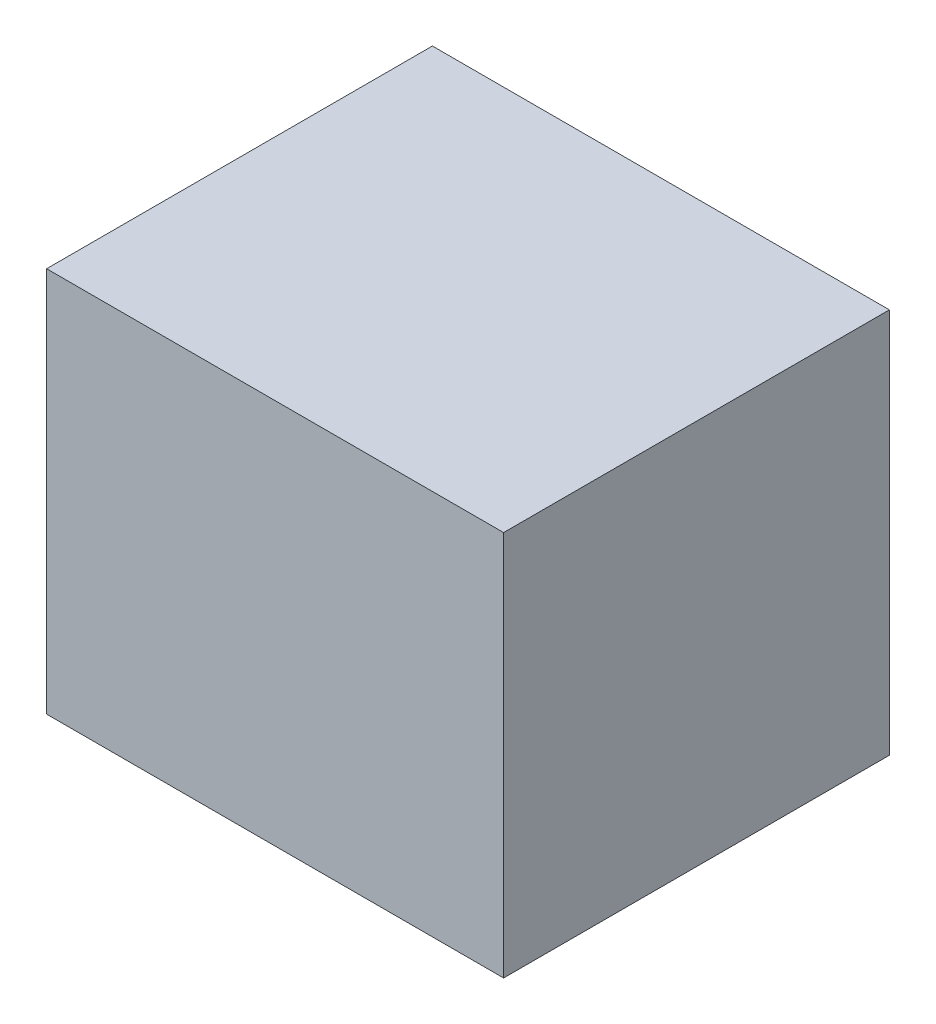
ISO-10303-21;
HEADER;
FILE_DESCRIPTION(('STEP AP214'),'2;1');
FILE_NAME('part.step','',(''),(''),'','','');
FILE_SCHEMA(('AUTOMOTIVE_DESIGN { 1 0 10303 214 1 1 1 1 }'));
ENDSEC;
DATA;
#1=APPLICATION_CONTEXT('core data for automotive mechanical design processes');
#2=APPLICATION_PROTOCOL_DEFINITION('international standard','automotive_design',2000,#1);
#3=PRODUCT_CONTEXT('',#1,'mechanical');
#4=PRODUCT('Part','Part','',(#3));
#5=PRODUCT_RELATED_PRODUCT_CATEGORY('part','',(#4));
#6=PRODUCT_DEFINITION_FORMATION('','',#4);
#7=PRODUCT_DEFINITION_CONTEXT('part definition',#1,'design');
#8=PRODUCT_DEFINITION('design','',#6,#7);
#9=PRODUCT_DEFINITION_SHAPE('','',#8);
#10=(LENGTH_UNIT() NAMED_UNIT(*) SI_UNIT(.MILLI.,.METRE.));
#11=(NAMED_UNIT(*) PLANE_ANGLE_UNIT() SI_UNIT($,.RADIAN.));
#12=(NAMED_UNIT(*) SI_UNIT($,.STERADIAN.) SOLID_ANGLE_UNIT());
#13=UNCERTAINTY_MEASURE_WITH_UNIT(LENGTH_MEASURE(1.E-05),#10,'distance_accuracy_value','');
#14=(GEOMETRIC_REPRESENTATION_CONTEXT(3) GLOBAL_UNCERTAINTY_ASSIGNED_CONTEXT((#13)) GLOBAL_UNIT_ASSIGNED_CONTEXT((#10,
#11,#12)) REPRESENTATION_CONTEXT('',''));
#15=CARTESIAN_POINT('',(0.,0.,0.));
#16=DIRECTION('',(0.,0.,1.));
#17=DIRECTION('',(1.,0.,0.));
#18=AXIS2_PLACEMENT_3D('',#15,#16,#17);
#19=CARTESIAN_POINT('',(-122.2375,-103.1875,-206.375));
#20=DIRECTION('',(1.,0.,0.));
#21=DIRECTION('',(0.,0.,-1.));
#22=AXIS2_PLACEMENT_3D('',#19,#20,#21);
#23=PLANE('',#22);
#24=DIRECTION('',(0.,1.,0.));
#25=VECTOR('',#24,1.);
#26=CARTESIAN_POINT('',(-122.2375,-103.1875,0.));
#27=LINE('',#26,#25);
#28=CARTESIAN_POINT('',(-122.2375,-103.1875,0.));
#29=VERTEX_POINT('',#28);
#30=CARTESIAN_POINT('',(-122.2375,103.1875,0.));
#31=VERTEX_POINT('',#30);
#32=EDGE_CURVE('E150',#29,#31,#27,.T.);
#33=ORIENTED_EDGE('',*,*,#32,.T.);
#34=DIRECTION('',(0.,0.,1.));
#35=VECTOR('',#34,1.);
#36=CARTESIAN_POINT('',(-122.2375,103.1875,-206.375));
#37=LINE('',#36,#35);
#38=CARTESIAN_POINT('',(-122.2375,103.1875,-206.375));
#39=VERTEX_POINT('',#38);
#40=EDGE_CURVE('E11',#39,#31,#37,.T.);
#41=ORIENTED_EDGE('',*,*,#40,.F.);
#42=DIRECTION('',(0.,1.,0.));
#43=VECTOR('',#42,1.);
#44=CARTESIAN_POINT('',(-122.2375,-103.1875,-206.375));
#45=LINE('',#44,#43);
#46=CARTESIAN_POINT('',(-122.2375,-103.1875,-206.375));
#47=VERTEX_POINT('',#46);
#48=EDGE_CURVE('E141',#47,#39,#45,.T.);
#49=ORIENTED_EDGE('',*,*,#48,.F.);
#50=DIRECTION('',(0.,0.,1.));
#51=VECTOR('',#50,1.);
#52=CARTESIAN_POINT('',(-122.2375,-103.1875,-206.375));
#53=LINE('',#52,#51);
#54=EDGE_CURVE('E56',#47,#29,#53,.T.);
#55=ORIENTED_EDGE('',*,*,#54,.T.);
#56=EDGE_LOOP('',(#33,#41,#49,#55));
#57=FACE_BOUND('',#56,.T.);
#58=ADVANCED_FACE('F33',(#57),#23,.F.);
#59=CARTESIAN_POINT('',(-122.2375,103.1875,-206.375));
#60=DIRECTION('',(0.,-1.,0.));
#61=DIRECTION('',(0.,0.,-1.));
#62=AXIS2_PLACEMENT_3D('',#59,#60,#61);
#63=PLANE('',#62);
#64=DIRECTION('',(1.,0.,0.));
#65=VECTOR('',#64,1.);
#66=CARTESIAN_POINT('',(-122.2375,103.1875,0.));
#67=LINE('',#66,#65);
#68=CARTESIAN_POINT('',(122.2375,103.1875,0.));
#69=VERTEX_POINT('',#68);
#70=EDGE_CURVE('E152',#31,#69,#67,.T.);
#71=ORIENTED_EDGE('',*,*,#70,.T.);
#72=DIRECTION('',(0.,0.,1.));
#73=VECTOR('',#72,1.);
#74=CARTESIAN_POINT('',(122.2375,103.1875,-206.375));
#75=LINE('',#74,#73);
#76=CARTESIAN_POINT('',(122.2375,103.1875,-206.375));
#77=VERTEX_POINT('',#76);
#78=EDGE_CURVE('E40',#77,#69,#75,.T.);
#79=ORIENTED_EDGE('',*,*,#78,.F.);
#80=DIRECTION('',(1.,0.,0.));
#81=VECTOR('',#80,1.);
#82=CARTESIAN_POINT('',(-122.2375,103.1875,-206.375));
#83=LINE('',#82,#81);
#84=EDGE_CURVE('E82',#39,#77,#83,.T.);
#85=ORIENTED_EDGE('',*,*,#84,.F.);
#86=ORIENTED_EDGE('',*,*,#40,.T.);
#87=EDGE_LOOP('',(#71,#79,#85,#86));
#88=FACE_BOUND('',#87,.T.);
#89=ADVANCED_FACE('F166',(#88),#63,.F.);
#90=CARTESIAN_POINT('',(122.2375,-103.1875,-206.375));
#91=DIRECTION('',(1.,0.,0.));
#92=DIRECTION('',(0.,0.,-1.));
#93=AXIS2_PLACEMENT_3D('',#90,#91,#92);
#94=PLANE('',#93);
#95=DIRECTION('',(0.,1.,0.));
#96=VECTOR('',#95,1.);
#97=CARTESIAN_POINT('',(122.2375,-103.1875,0.));
#98=LINE('',#97,#96);
#99=CARTESIAN_POINT('',(122.2375,-103.1875,0.));
#100=VERTEX_POINT('',#99);
#101=EDGE_CURVE('E155',#100,#69,#98,.T.);
#102=ORIENTED_EDGE('',*,*,#101,.F.);
#103=DIRECTION('',(0.,0.,1.));
#104=VECTOR('',#103,1.);
#105=CARTESIAN_POINT('',(122.2375,-103.1875,-206.375));
#106=LINE('',#105,#104);
#107=CARTESIAN_POINT('',(122.2375,-103.1875,-206.375));
#108=VERTEX_POINT('',#107);
#109=EDGE_CURVE('E161',#108,#100,#106,.T.);
#110=ORIENTED_EDGE('',*,*,#109,.F.);
#111=DIRECTION('',(0.,1.,0.));
#112=VECTOR('',#111,1.);
#113=CARTESIAN_POINT('',(122.2375,-103.1875,-206.375));
#114=LINE('',#113,#112);
#115=EDGE_CURVE('E145',#108,#77,#114,.T.);
#116=ORIENTED_EDGE('',*,*,#115,.T.);
#117=ORIENTED_EDGE('',*,*,#78,.T.);
#118=EDGE_LOOP('',(#102,#110,#116,#117));
#119=FACE_BOUND('',#118,.T.);
#120=ADVANCED_FACE('F164',(#119),#94,.T.);
#121=CARTESIAN_POINT('',(-122.2375,-103.1875,-206.375));
#122=DIRECTION('',(0.,-1.,0.));
#123=DIRECTION('',(0.,0.,-1.));
#124=AXIS2_PLACEMENT_3D('',#121,#122,#123);
#125=PLANE('',#124);
#126=DIRECTION('',(1.,0.,0.));
#127=VECTOR('',#126,1.);
#128=CARTESIAN_POINT('',(-122.2375,-103.1875,0.));
#129=LINE('',#128,#127);
#130=EDGE_CURVE('E143',#29,#100,#129,.T.);
#131=ORIENTED_EDGE('',*,*,#130,.F.);
#132=ORIENTED_EDGE('',*,*,#54,.F.);
#133=DIRECTION('',(1.,0.,0.));
#134=VECTOR('',#133,1.);
#135=CARTESIAN_POINT('',(-122.2375,-103.1875,-206.375));
#136=LINE('',#135,#134);
#137=EDGE_CURVE('E148',#47,#108,#136,.T.);
#138=ORIENTED_EDGE('',*,*,#137,.T.);
#139=ORIENTED_EDGE('',*,*,#109,.T.);
#140=EDGE_LOOP('',(#131,#132,#138,#139));
#141=FACE_BOUND('',#140,.T.);
#142=ADVANCED_FACE('F170',(#141),#125,.T.);
#143=CARTESIAN_POINT('',(0.,0.,-206.375));
#144=DIRECTION('',(0.,0.,-1.));
#145=DIRECTION('',(-1.,0.,0.));
#146=AXIS2_PLACEMENT_3D('',#143,#144,#145);
#147=PLANE('',#146);
#148=DIRECTION('',(0.,1.,0.));
#149=VECTOR('',#148,1.);
#150=CARTESIAN_POINT('',(-119.0625,-103.1875,-206.375));
#151=LINE('',#150,#149);
#152=CARTESIAN_POINT('',(-119.0625,-100.0125,-206.375));
#153=VERTEX_POINT('',#152);
#154=CARTESIAN_POINT('',(-119.0625,100.0125,-206.375));
#155=VERTEX_POINT('',#154);
#156=EDGE_CURVE('E131',#153,#155,#151,.T.);
#157=ORIENTED_EDGE('',*,*,#156,.F.);
#158=DIRECTION('',(1.,0.,0.));
#159=VECTOR('',#158,1.);
#160=CARTESIAN_POINT('',(-122.2375,-100.0125,-206.375));
#161=LINE('',#160,#159);
#162=CARTESIAN_POINT('',(119.0625,-100.0125,-206.375));
#163=VERTEX_POINT('',#162);
#164=EDGE_CURVE('E112',#153,#163,#161,.T.);
#165=ORIENTED_EDGE('',*,*,#164,.T.);
#166=DIRECTION('',(0.,1.,0.));
#167=VECTOR('',#166,1.);
#168=CARTESIAN_POINT('',(119.0625,-103.1875,-206.375));
#169=LINE('',#168,#167);
#170=CARTESIAN_POINT('',(119.0625,100.0125,-206.375));
#171=VERTEX_POINT('',#170);
#172=EDGE_CURVE('E47',#163,#171,#169,.T.);
#173=ORIENTED_EDGE('',*,*,#172,.T.);
#174=DIRECTION('',(1.,0.,0.));
#175=VECTOR('',#174,1.);
#176=CARTESIAN_POINT('',(-122.2375,100.0125,-206.375));
#177=LINE('',#176,#175);
#178=EDGE_CURVE('E133',#155,#171,#177,.T.);
#179=ORIENTED_EDGE('',*,*,#178,.F.);
#180=EDGE_LOOP('',(#157,#165,#173,#179));
#181=FACE_BOUND('',#180,.T.);
#182=ORIENTED_EDGE('',*,*,#48,.T.);
#183=ORIENTED_EDGE('',*,*,#84,.T.);
#184=ORIENTED_EDGE('',*,*,#115,.F.);
#185=ORIENTED_EDGE('',*,*,#137,.F.);
#186=EDGE_LOOP('',(#182,#183,#184,#185));
#187=FACE_BOUND('',#186,.T.);
#188=ADVANCED_FACE('F173',(#181,#187),#147,.T.);
#189=CARTESIAN_POINT('',(0.,0.,0.));
#190=DIRECTION('',(0.,0.,-1.));
#191=DIRECTION('',(-1.,0.,0.));
#192=AXIS2_PLACEMENT_3D('',#189,#190,#191);
#193=PLANE('',#192);
#194=ORIENTED_EDGE('',*,*,#32,.F.);
#195=ORIENTED_EDGE('',*,*,#130,.T.);
#196=ORIENTED_EDGE('',*,*,#101,.T.);
#197=ORIENTED_EDGE('',*,*,#70,.F.);
#198=EDGE_LOOP('',(#194,#195,#196,#197));
#199=FACE_BOUND('',#198,.T.);
#200=ADVANCED_FACE('F169',(#199),#193,.F.);
#201=CARTESIAN_POINT('',(-119.0625,-103.1875,-206.375));
#202=DIRECTION('',(1.,0.,0.));
#203=DIRECTION('',(0.,0.,-1.));
#204=AXIS2_PLACEMENT_3D('',#201,#202,#203);
#205=PLANE('',#204);
#206=DIRECTION('',(0.,1.,0.));
#207=VECTOR('',#206,1.);
#208=CARTESIAN_POINT('',(-119.0625,-103.1875,-3.17500000000001));
#209=LINE('',#208,#207);
#210=CARTESIAN_POINT('',(-119.0625,-100.0125,-3.175));
#211=VERTEX_POINT('',#210);
#212=CARTESIAN_POINT('',(-119.0625,100.0125,-3.175));
#213=VERTEX_POINT('',#212);
#214=EDGE_CURVE('E119',#211,#213,#209,.T.);
#215=ORIENTED_EDGE('',*,*,#214,.F.);
#216=DIRECTION('',(0.,0.,1.));
#217=VECTOR('',#216,1.);
#218=CARTESIAN_POINT('',(-119.0625,-100.0125,-206.375));
#219=LINE('',#218,#217);
#220=EDGE_CURVE('E106',#153,#211,#219,.T.);
#221=ORIENTED_EDGE('',*,*,#220,.F.);
#222=ORIENTED_EDGE('',*,*,#156,.T.);
#223=DIRECTION('',(0.,0.,1.));
#224=VECTOR('',#223,1.);
#225=CARTESIAN_POINT('',(-119.0625,100.0125,-206.375));
#226=LINE('',#225,#224);
#227=EDGE_CURVE('E122',#155,#213,#226,.T.);
#228=ORIENTED_EDGE('',*,*,#227,.T.);
#229=EDGE_LOOP('',(#215,#221,#222,#228));
#230=FACE_BOUND('',#229,.T.);
#231=ADVANCED_FACE('F120',(#230),#205,.T.);
#232=CARTESIAN_POINT('',(-122.2375,100.0125,-206.375));
#233=DIRECTION('',(0.,-1.,0.));
#234=DIRECTION('',(0.,0.,-1.));
#235=AXIS2_PLACEMENT_3D('',#232,#233,#234);
#236=PLANE('',#235);
#237=DIRECTION('',(1.,0.,0.));
#238=VECTOR('',#237,1.);
#239=CARTESIAN_POINT('',(-122.2375,100.0125,-3.17500000000001));
#240=LINE('',#239,#238);
#241=CARTESIAN_POINT('',(119.0625,100.0125,-3.175));
#242=VERTEX_POINT('',#241);
#243=EDGE_CURVE('E125',#213,#242,#240,.T.);
#244=ORIENTED_EDGE('',*,*,#243,.F.);
#245=ORIENTED_EDGE('',*,*,#227,.F.);
#246=ORIENTED_EDGE('',*,*,#178,.T.);
#247=DIRECTION('',(0.,0.,1.));
#248=VECTOR('',#247,1.);
#249=CARTESIAN_POINT('',(119.0625,100.0125,-206.375));
#250=LINE('',#249,#248);
#251=EDGE_CURVE('E265',#171,#242,#250,.T.);
#252=ORIENTED_EDGE('',*,*,#251,.T.);
#253=EDGE_LOOP('',(#244,#245,#246,#252));
#254=FACE_BOUND('',#253,.T.);
#255=ADVANCED_FACE('F197',(#254),#236,.T.);
#256=CARTESIAN_POINT('',(119.0625,-103.1875,-206.375));
#257=DIRECTION('',(1.,0.,0.));
#258=DIRECTION('',(0.,0.,-1.));
#259=AXIS2_PLACEMENT_3D('',#256,#257,#258);
#260=PLANE('',#259);
#261=DIRECTION('',(0.,1.,0.));
#262=VECTOR('',#261,1.);
#263=CARTESIAN_POINT('',(119.0625,-103.1875,-3.17500000000001));
#264=LINE('',#263,#262);
#265=CARTESIAN_POINT('',(119.0625,-100.0125,-3.175));
#266=VERTEX_POINT('',#265);
#267=EDGE_CURVE('E130',#266,#242,#264,.T.);
#268=ORIENTED_EDGE('',*,*,#267,.T.);
#269=ORIENTED_EDGE('',*,*,#251,.F.);
#270=ORIENTED_EDGE('',*,*,#172,.F.);
#271=DIRECTION('',(0.,0.,1.));
#272=VECTOR('',#271,1.);
#273=CARTESIAN_POINT('',(119.0625,-100.0125,-206.375));
#274=LINE('',#273,#272);
#275=EDGE_CURVE('E115',#163,#266,#274,.T.);
#276=ORIENTED_EDGE('',*,*,#275,.T.);
#277=EDGE_LOOP('',(#268,#269,#270,#276));
#278=FACE_BOUND('',#277,.T.);
#279=ADVANCED_FACE('F194',(#278),#260,.F.);
#280=CARTESIAN_POINT('',(-122.2375,-100.0125,-206.375));
#281=DIRECTION('',(0.,-1.,0.));
#282=DIRECTION('',(0.,0.,-1.));
#283=AXIS2_PLACEMENT_3D('',#280,#281,#282);
#284=PLANE('',#283);
#285=DIRECTION('',(1.,0.,0.));
#286=VECTOR('',#285,1.);
#287=CARTESIAN_POINT('',(-122.2375,-100.0125,-3.17500000000001));
#288=LINE('',#287,#286);
#289=EDGE_CURVE('E110',#211,#266,#288,.T.);
#290=ORIENTED_EDGE('',*,*,#289,.T.);
#291=ORIENTED_EDGE('',*,*,#275,.F.);
#292=ORIENTED_EDGE('',*,*,#164,.F.);
#293=ORIENTED_EDGE('',*,*,#220,.T.);
#294=EDGE_LOOP('',(#290,#291,#292,#293));
#295=FACE_BOUND('',#294,.T.);
#296=ADVANCED_FACE('F108',(#295),#284,.F.);
#297=CARTESIAN_POINT('',(0.,0.,-3.175));
#298=DIRECTION('',(0.,0.,-1.));
#299=DIRECTION('',(-1.,0.,0.));
#300=AXIS2_PLACEMENT_3D('',#297,#298,#299);
#301=PLANE('',#300);
#302=ORIENTED_EDGE('',*,*,#214,.T.);
#303=ORIENTED_EDGE('',*,*,#243,.T.);
#304=ORIENTED_EDGE('',*,*,#267,.F.);
#305=ORIENTED_EDGE('',*,*,#289,.F.);
#306=EDGE_LOOP('',(#302,#303,#304,#305));
#307=FACE_BOUND('',#306,.T.);
#308=ADVANCED_FACE('F128',(#307),#301,.T.);
#309=CLOSED_SHELL('',(#58,#89,#120,#142,#188,#200,#231,#255,#279,#296,#308));
#310=MANIFOLD_SOLID_BREP('B2',#309);
#311=ADVANCED_BREP_SHAPE_REPRESENTATION('',(#18,#310),#14);
#312=SHAPE_DEFINITION_REPRESENTATION(#9,#311);
ENDSEC;
END-ISO-10303-21;
